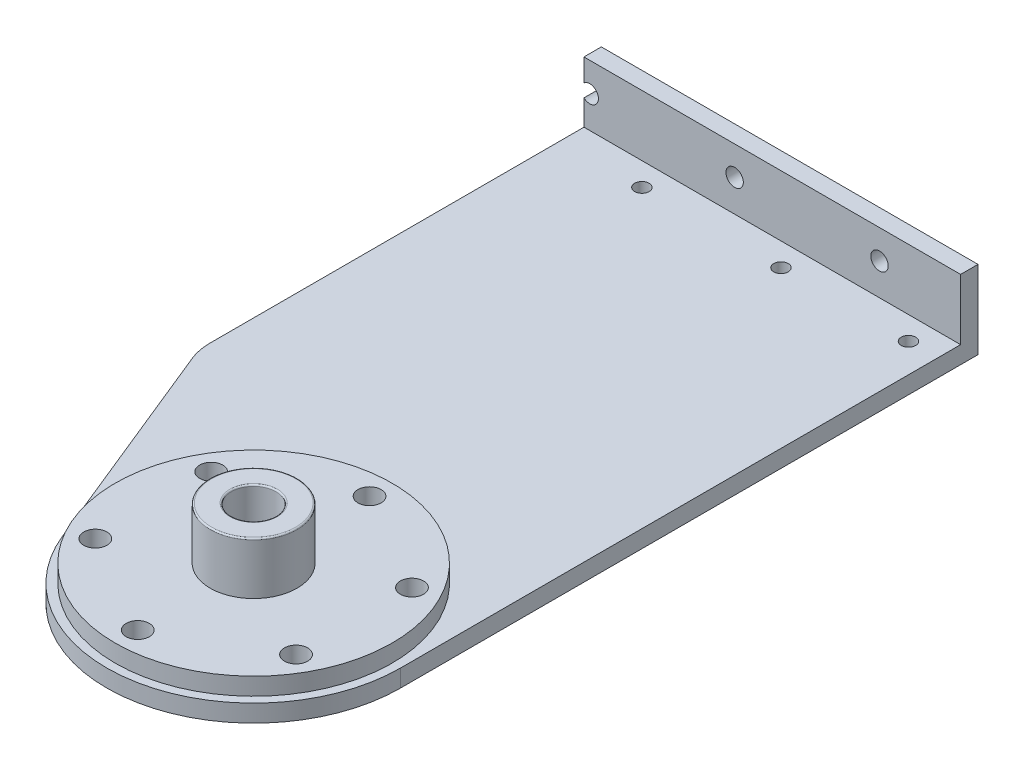
ISO-10303-21;
HEADER;
FILE_DESCRIPTION(('STEP AP214'),'2;1');
FILE_NAME('part.step','',(''),(''),'','','');
FILE_SCHEMA(('AUTOMOTIVE_DESIGN { 1 0 10303 214 1 1 1 1 }'));
ENDSEC;
DATA;
#1=APPLICATION_CONTEXT('core data for automotive mechanical design processes');
#2=APPLICATION_PROTOCOL_DEFINITION('international standard','automotive_design',2000,#1);
#3=PRODUCT_CONTEXT('',#1,'mechanical');
#4=PRODUCT('Part','Part','',(#3));
#5=PRODUCT_RELATED_PRODUCT_CATEGORY('part','',(#4));
#6=PRODUCT_DEFINITION_FORMATION('','',#4);
#7=PRODUCT_DEFINITION_CONTEXT('part definition',#1,'design');
#8=PRODUCT_DEFINITION('design','',#6,#7);
#9=PRODUCT_DEFINITION_SHAPE('','',#8);
#10=(LENGTH_UNIT() NAMED_UNIT(*) SI_UNIT(.MILLI.,.METRE.));
#11=(NAMED_UNIT(*) PLANE_ANGLE_UNIT() SI_UNIT($,.RADIAN.));
#12=(NAMED_UNIT(*) SI_UNIT($,.STERADIAN.) SOLID_ANGLE_UNIT());
#13=UNCERTAINTY_MEASURE_WITH_UNIT(LENGTH_MEASURE(1.E-05),#10,'distance_accuracy_value','');
#14=(GEOMETRIC_REPRESENTATION_CONTEXT(3) GLOBAL_UNCERTAINTY_ASSIGNED_CONTEXT((#13)) GLOBAL_UNIT_ASSIGNED_CONTEXT((#10,
#11,#12)) REPRESENTATION_CONTEXT('',''));
#15=CARTESIAN_POINT('',(0.,0.,0.));
#16=DIRECTION('',(0.,0.,1.));
#17=DIRECTION('',(1.,0.,0.));
#18=AXIS2_PLACEMENT_3D('',#15,#16,#17);
#19=CARTESIAN_POINT('',(-39.65,-3.,0.));
#20=DIRECTION('',(-1.,0.,0.));
#21=DIRECTION('',(0.,0.,1.));
#22=AXIS2_PLACEMENT_3D('',#19,#20,#21);
#23=PLANE('',#22);
#24=DIRECTION('',(0.,0.,-1.));
#25=VECTOR('',#24,1.);
#26=CARTESIAN_POINT('',(-39.65,6.6180339887499,-92.4073593128807));
#27=LINE('',#26,#25);
#28=CARTESIAN_POINT('',(-39.65,6.6180339887499,-96.65));
#29=VERTEX_POINT('',#28);
#30=CARTESIAN_POINT('',(-39.65,6.6180339887499,-99.65));
#31=VERTEX_POINT('',#30);
#32=EDGE_CURVE('E196',#29,#31,#27,.T.);
#33=ORIENTED_EDGE('',*,*,#32,.F.);
#34=DIRECTION('',(0.,1.,0.));
#35=VECTOR('',#34,1.);
#36=CARTESIAN_POINT('',(-39.65,10.5,-96.65));
#37=LINE('',#36,#35);
#38=CARTESIAN_POINT('',(-39.65,10.5,-96.65));
#39=VERTEX_POINT('',#38);
#40=EDGE_CURVE('E204',#29,#39,#37,.T.);
#41=ORIENTED_EDGE('',*,*,#40,.T.);
#42=DIRECTION('',(0.,0.,1.));
#43=VECTOR('',#42,1.);
#44=CARTESIAN_POINT('',(-39.65,10.5,-99.65));
#45=LINE('',#44,#43);
#46=CARTESIAN_POINT('',(-39.65,10.5,-99.65));
#47=VERTEX_POINT('',#46);
#48=EDGE_CURVE('E219',#47,#39,#45,.T.);
#49=ORIENTED_EDGE('',*,*,#48,.F.);
#50=DIRECTION('',(0.,1.,0.));
#51=VECTOR('',#50,1.);
#52=CARTESIAN_POINT('',(-39.65,10.5,-99.65));
#53=LINE('',#52,#51);
#54=EDGE_CURVE('E209',#31,#47,#53,.T.);
#55=ORIENTED_EDGE('',*,*,#54,.F.);
#56=EDGE_LOOP('',(#33,#41,#49,#55));
#57=FACE_BOUND('',#56,.T.);
#58=ADVANCED_FACE('F111',(#57),#23,.T.);
#59=CARTESIAN_POINT('',(0.,0.,0.));
#60=DIRECTION('',(0.,1.,0.));
#61=DIRECTION('',(0.,0.,1.));
#62=AXIS2_PLACEMENT_3D('',#59,#60,#61);
#63=PLANE('',#62);
#64=DIRECTION('',(0.,0.,1.));
#65=VECTOR('',#64,1.);
#66=CARTESIAN_POINT('',(-39.65,0.,0.));
#67=LINE('',#66,#65);
#68=CARTESIAN_POINT('',(-39.65,0.,-96.65));
#69=VERTEX_POINT('',#68);
#70=CARTESIAN_POINT('',(-39.65,0.,-32.1081531572583));
#71=VERTEX_POINT('',#70);
#72=EDGE_CURVE('E363',#69,#71,#67,.T.);
#73=ORIENTED_EDGE('',*,*,#72,.T.);
#74=CARTESIAN_POINT('',(-29.65,0.,-32.1081531572583));
#75=DIRECTION('',(0.,1.,0.));
#76=DIRECTION('',(0.,0.,1.));
#77=AXIS2_PLACEMENT_3D('',#74,#75,#76);
#78=CIRCLE('',#77,10.);
#79=CARTESIAN_POINT('',(-38.9114460863581,0.,-28.336467010522));
#80=VERTEX_POINT('',#79);
#81=EDGE_CURVE('E366',#71,#80,#78,.T.);
#82=ORIENTED_EDGE('',*,*,#81,.T.);
#83=DIRECTION('',(0.377168614673627,0.,0.92614460863581));
#84=VECTOR('',#83,1.);
#85=CARTESIAN_POINT('',(-23.4777658289178,0.,9.56122438197645));
#86=LINE('',#85,#84);
#87=CARTESIAN_POINT('',(-23.4777658289178,0.,9.56122438197645));
#88=VERTEX_POINT('',#87);
#89=EDGE_CURVE('E370',#80,#88,#86,.T.);
#90=ORIENTED_EDGE('',*,*,#89,.T.);
#91=CARTESIAN_POINT('',(0.,0.,0.));
#92=DIRECTION('',(0.,1.,0.));
#93=DIRECTION('',(0.,0.,1.));
#94=AXIS2_PLACEMENT_3D('',#91,#92,#93);
#95=CIRCLE('',#94,25.35);
#96=CARTESIAN_POINT('',(25.35,0.,0.));
#97=VERTEX_POINT('',#96);
#98=EDGE_CURVE('E374',#88,#97,#95,.T.);
#99=ORIENTED_EDGE('',*,*,#98,.T.);
#100=DIRECTION('',(0.,0.,-1.));
#101=VECTOR('',#100,1.);
#102=CARTESIAN_POINT('',(25.35,0.,0.));
#103=LINE('',#102,#101);
#104=CARTESIAN_POINT('',(25.35,0.,-96.65));
#105=VERTEX_POINT('',#104);
#106=EDGE_CURVE('E378',#97,#105,#103,.T.);
#107=ORIENTED_EDGE('',*,*,#106,.T.);
#108=DIRECTION('',(1.,0.,0.));
#109=VECTOR('',#108,1.);
#110=CARTESIAN_POINT('',(0.,0.,-96.65));
#111=LINE('',#110,#109);
#112=EDGE_CURVE('E160',#69,#105,#111,.T.);
#113=ORIENTED_EDGE('',*,*,#112,.F.);
#114=EDGE_LOOP('',(#73,#82,#90,#99,#107,#113));
#115=FACE_BOUND('',#114,.T.);
#116=CARTESIAN_POINT('',(20.35,0.,-92.65));
#117=DIRECTION('',(0.,1.,0.));
#118=DIRECTION('',(0.,0.,1.));
#119=AXIS2_PLACEMENT_3D('',#116,#117,#118);
#120=CIRCLE('',#119,1.25);
#121=CARTESIAN_POINT('',(20.35,0.,-91.4));
#122=VERTEX_POINT('',#121);
#123=EDGE_CURVE('E359',#122,#122,#120,.T.);
#124=ORIENTED_EDGE('',*,*,#123,.F.);
#125=EDGE_LOOP('',(#124));
#126=FACE_BOUND('',#125,.T.);
#127=CARTESIAN_POINT('',(-1.64999999999999,0.,-92.65));
#128=DIRECTION('',(0.,1.,0.));
#129=DIRECTION('',(0.,0.,1.));
#130=AXIS2_PLACEMENT_3D('',#127,#128,#129);
#131=CIRCLE('',#130,1.25);
#132=CARTESIAN_POINT('',(-1.64999999999999,0.,-91.4));
#133=VERTEX_POINT('',#132);
#134=EDGE_CURVE('E355',#133,#133,#131,.T.);
#135=ORIENTED_EDGE('',*,*,#134,.F.);
#136=EDGE_LOOP('',(#135));
#137=FACE_BOUND('',#136,.T.);
#138=CARTESIAN_POINT('',(-25.65,0.,-92.65));
#139=DIRECTION('',(0.,1.,0.));
#140=DIRECTION('',(0.,0.,1.));
#141=AXIS2_PLACEMENT_3D('',#138,#139,#140);
#142=CIRCLE('',#141,1.25);
#143=CARTESIAN_POINT('',(-25.65,0.,-91.4));
#144=VERTEX_POINT('',#143);
#145=EDGE_CURVE('E293',#144,#144,#142,.T.);
#146=ORIENTED_EDGE('',*,*,#145,.F.);
#147=EDGE_LOOP('',(#146));
#148=FACE_BOUND('',#147,.T.);
#149=CARTESIAN_POINT('',(0.,0.,0.));
#150=DIRECTION('',(0.,1.,0.));
#151=DIRECTION('',(0.,0.,1.));
#152=AXIS2_PLACEMENT_3D('',#149,#150,#151);
#153=CIRCLE('',#152,23.9);
#154=CARTESIAN_POINT('',(0.,0.,23.9));
#155=VERTEX_POINT('',#154);
#156=EDGE_CURVE('E281',#155,#155,#153,.T.);
#157=ORIENTED_EDGE('',*,*,#156,.F.);
#158=EDGE_LOOP('',(#157));
#159=FACE_BOUND('',#158,.T.);
#160=ADVANCED_FACE('F433',(#115,#126,#137,#148,#159),#63,.T.);
#161=DIRECTION('',(0.,0.,-1.));
#162=VECTOR('',#161,1.);
#163=CARTESIAN_POINT('',(-39.65,4.38196601125009,-92.4073593128807));
#164=LINE('',#163,#162);
#165=CARTESIAN_POINT('',(-39.65,4.3819660112501,-99.65));
#166=VERTEX_POINT('',#165);
#167=CARTESIAN_POINT('',(-39.65,4.3819660112501,-96.65));
#168=VERTEX_POINT('',#167);
#169=EDGE_CURVE('E126',#166,#168,#164,.F.);
#170=ORIENTED_EDGE('',*,*,#169,.F.);
#171=CARTESIAN_POINT('',(-39.65,-3.,-99.65));
#172=VERTEX_POINT('',#171);
#173=EDGE_CURVE('E213',#172,#166,#53,.T.);
#174=ORIENTED_EDGE('',*,*,#173,.F.);
#175=DIRECTION('',(0.,0.,1.));
#176=VECTOR('',#175,1.);
#177=CARTESIAN_POINT('',(-39.65,-3.,0.));
#178=LINE('',#177,#176);
#179=CARTESIAN_POINT('',(-39.65,-3.,-32.1081531572583));
#180=VERTEX_POINT('',#179);
#181=EDGE_CURVE('E334',#172,#180,#178,.T.);
#182=ORIENTED_EDGE('',*,*,#181,.T.);
#183=DIRECTION('',(0.,1.,0.));
#184=VECTOR('',#183,1.);
#185=CARTESIAN_POINT('',(-39.65,-3.,-32.1081531572583));
#186=LINE('',#185,#184);
#187=EDGE_CURVE('E167',#180,#71,#186,.T.);
#188=ORIENTED_EDGE('',*,*,#187,.T.);
#189=ORIENTED_EDGE('',*,*,#72,.F.);
#190=EDGE_CURVE('E241',#69,#168,#37,.T.);
#191=ORIENTED_EDGE('',*,*,#190,.T.);
#192=EDGE_LOOP('',(#170,#174,#182,#188,#189,#191));
#193=FACE_BOUND('',#192,.T.);
#194=ADVANCED_FACE('F435',(#193),#23,.T.);
#195=CARTESIAN_POINT('',(25.35,-3.,0.));
#196=DIRECTION('',(1.,0.,0.));
#197=DIRECTION('',(0.,0.,-1.));
#198=AXIS2_PLACEMENT_3D('',#195,#196,#197);
#199=PLANE('',#198);
#200=ORIENTED_EDGE('',*,*,#106,.F.);
#201=DIRECTION('',(0.,1.,0.));
#202=VECTOR('',#201,1.);
#203=CARTESIAN_POINT('',(25.35,-3.,0.));
#204=LINE('',#203,#202);
#205=CARTESIAN_POINT('',(25.35,-3.,0.));
#206=VERTEX_POINT('',#205);
#207=EDGE_CURVE('E135',#206,#97,#204,.T.);
#208=ORIENTED_EDGE('',*,*,#207,.F.);
#209=DIRECTION('',(0.,0.,-1.));
#210=VECTOR('',#209,1.);
#211=CARTESIAN_POINT('',(25.35,-3.,0.));
#212=LINE('',#211,#210);
#213=CARTESIAN_POINT('',(25.35,-3.,-99.65));
#214=VERTEX_POINT('',#213);
#215=EDGE_CURVE('E349',#206,#214,#212,.T.);
#216=ORIENTED_EDGE('',*,*,#215,.T.);
#217=DIRECTION('',(0.,-1.,0.));
#218=VECTOR('',#217,1.);
#219=CARTESIAN_POINT('',(25.35,-3.,-99.65));
#220=LINE('',#219,#218);
#221=CARTESIAN_POINT('',(25.35,10.5,-99.65));
#222=VERTEX_POINT('',#221);
#223=EDGE_CURVE('E233',#222,#214,#220,.T.);
#224=ORIENTED_EDGE('',*,*,#223,.F.);
#225=DIRECTION('',(0.,0.,1.));
#226=VECTOR('',#225,1.);
#227=CARTESIAN_POINT('',(25.35,10.5,-99.65));
#228=LINE('',#227,#226);
#229=CARTESIAN_POINT('',(25.35,10.5,-96.65));
#230=VERTEX_POINT('',#229);
#231=EDGE_CURVE('E240',#222,#230,#228,.T.);
#232=ORIENTED_EDGE('',*,*,#231,.T.);
#233=DIRECTION('',(0.,-1.,0.));
#234=VECTOR('',#233,1.);
#235=CARTESIAN_POINT('',(25.35,-3.,-96.65));
#236=LINE('',#235,#234);
#237=EDGE_CURVE('E221',#230,#105,#236,.T.);
#238=ORIENTED_EDGE('',*,*,#237,.T.);
#239=EDGE_LOOP('',(#200,#208,#216,#224,#232,#238));
#240=FACE_BOUND('',#239,.T.);
#241=ADVANCED_FACE('F443',(#240),#199,.T.);
#242=CARTESIAN_POINT('',(0.,-3.,0.));
#243=DIRECTION('',(0.,1.,0.));
#244=DIRECTION('',(0.,0.,1.));
#245=AXIS2_PLACEMENT_3D('',#242,#243,#244);
#246=CYLINDRICAL_SURFACE('',#245,25.35);
#247=ORIENTED_EDGE('',*,*,#98,.F.);
#248=DIRECTION('',(0.,1.,0.));
#249=VECTOR('',#248,1.);
#250=CARTESIAN_POINT('',(-23.4777658289178,-3.,9.56122438197645));
#251=LINE('',#250,#249);
#252=CARTESIAN_POINT('',(-23.4777658289178,-3.,9.56122438197645));
#253=VERTEX_POINT('',#252);
#254=EDGE_CURVE('E386',#253,#88,#251,.T.);
#255=ORIENTED_EDGE('',*,*,#254,.F.);
#256=CARTESIAN_POINT('',(0.,-3.,0.));
#257=DIRECTION('',(0.,1.,0.));
#258=DIRECTION('',(0.,0.,1.));
#259=AXIS2_PLACEMENT_3D('',#256,#257,#258);
#260=CIRCLE('',#259,25.35);
#261=EDGE_CURVE('E345',#253,#206,#260,.T.);
#262=ORIENTED_EDGE('',*,*,#261,.T.);
#263=ORIENTED_EDGE('',*,*,#207,.T.);
#264=EDGE_LOOP('',(#247,#255,#262,#263));
#265=FACE_BOUND('',#264,.T.);
#266=ADVANCED_FACE('F448',(#265),#246,.T.);
#267=CARTESIAN_POINT('',(-23.4777658289178,-3.,9.56122438197645));
#268=DIRECTION('',(-0.92614460863581,0.,0.377168614673627));
#269=DIRECTION('',(0.377168614673627,0.,0.92614460863581));
#270=AXIS2_PLACEMENT_3D('',#267,#268,#269);
#271=PLANE('',#270);
#272=ORIENTED_EDGE('',*,*,#89,.F.);
#273=DIRECTION('',(0.,1.,0.));
#274=VECTOR('',#273,1.);
#275=CARTESIAN_POINT('',(-38.9114460863581,-3.,-28.336467010522));
#276=LINE('',#275,#274);
#277=CARTESIAN_POINT('',(-38.9114460863581,-3.,-28.336467010522));
#278=VERTEX_POINT('',#277);
#279=EDGE_CURVE('E389',#278,#80,#276,.T.);
#280=ORIENTED_EDGE('',*,*,#279,.F.);
#281=DIRECTION('',(0.377168614673627,0.,0.92614460863581));
#282=VECTOR('',#281,1.);
#283=CARTESIAN_POINT('',(-23.4777658289178,-3.,9.56122438197645));
#284=LINE('',#283,#282);
#285=EDGE_CURVE('E341',#278,#253,#284,.T.);
#286=ORIENTED_EDGE('',*,*,#285,.T.);
#287=ORIENTED_EDGE('',*,*,#254,.T.);
#288=EDGE_LOOP('',(#272,#280,#286,#287));
#289=FACE_BOUND('',#288,.T.);
#290=ADVANCED_FACE('F532',(#289),#271,.T.);
#291=CARTESIAN_POINT('',(20.35,-3.,-92.65));
#292=DIRECTION('',(0.,1.,0.));
#293=DIRECTION('',(0.,0.,1.));
#294=AXIS2_PLACEMENT_3D('',#291,#292,#293);
#295=CYLINDRICAL_SURFACE('',#294,1.25);
#296=CARTESIAN_POINT('',(20.35,-3.,-92.65));
#297=DIRECTION('',(0.,1.,0.));
#298=DIRECTION('',(0.,0.,1.));
#299=AXIS2_PLACEMENT_3D('',#296,#297,#298);
#300=CIRCLE('',#299,1.25);
#301=CARTESIAN_POINT('',(20.35,-3.,-91.4));
#302=VERTEX_POINT('',#301);
#303=EDGE_CURVE('E330',#302,#302,#300,.T.);
#304=ORIENTED_EDGE('',*,*,#303,.F.);
#305=EDGE_LOOP('',(#304));
#306=FACE_BOUND('',#305,.T.);
#307=ORIENTED_EDGE('',*,*,#123,.T.);
#308=EDGE_LOOP('',(#307));
#309=FACE_BOUND('',#308,.T.);
#310=ADVANCED_FACE('F535',(#306,#309),#295,.F.);
#311=CARTESIAN_POINT('',(-1.64999999999999,-3.,-92.65));
#312=DIRECTION('',(0.,1.,0.));
#313=DIRECTION('',(0.,0.,1.));
#314=AXIS2_PLACEMENT_3D('',#311,#312,#313);
#315=CYLINDRICAL_SURFACE('',#314,1.25);
#316=CARTESIAN_POINT('',(-1.64999999999999,-3.,-92.65));
#317=DIRECTION('',(0.,1.,0.));
#318=DIRECTION('',(0.,0.,1.));
#319=AXIS2_PLACEMENT_3D('',#316,#317,#318);
#320=CIRCLE('',#319,1.25);
#321=CARTESIAN_POINT('',(-1.64999999999999,-3.,-91.4));
#322=VERTEX_POINT('',#321);
#323=EDGE_CURVE('E326',#322,#322,#320,.T.);
#324=ORIENTED_EDGE('',*,*,#323,.F.);
#325=EDGE_LOOP('',(#324));
#326=FACE_BOUND('',#325,.T.);
#327=ORIENTED_EDGE('',*,*,#134,.T.);
#328=EDGE_LOOP('',(#327));
#329=FACE_BOUND('',#328,.T.);
#330=ADVANCED_FACE('F577',(#326,#329),#315,.F.);
#331=CARTESIAN_POINT('',(-25.65,-3.,-92.65));
#332=DIRECTION('',(0.,1.,0.));
#333=DIRECTION('',(0.,0.,1.));
#334=AXIS2_PLACEMENT_3D('',#331,#332,#333);
#335=CYLINDRICAL_SURFACE('',#334,1.25);
#336=CARTESIAN_POINT('',(-25.65,-3.,-92.65));
#337=DIRECTION('',(0.,1.,0.));
#338=DIRECTION('',(0.,0.,1.));
#339=AXIS2_PLACEMENT_3D('',#336,#337,#338);
#340=CIRCLE('',#339,1.25);
#341=CARTESIAN_POINT('',(-25.65,-3.,-91.4));
#342=VERTEX_POINT('',#341);
#343=EDGE_CURVE('E322',#342,#342,#340,.T.);
#344=ORIENTED_EDGE('',*,*,#343,.F.);
#345=EDGE_LOOP('',(#344));
#346=FACE_BOUND('',#345,.T.);
#347=ORIENTED_EDGE('',*,*,#145,.T.);
#348=EDGE_LOOP('',(#347));
#349=FACE_BOUND('',#348,.T.);
#350=ADVANCED_FACE('F573',(#346,#349),#335,.F.);
#351=CARTESIAN_POINT('',(0.,-3.,0.));
#352=DIRECTION('',(0.,1.,0.));
#353=DIRECTION('',(0.,0.,1.));
#354=AXIS2_PLACEMENT_3D('',#351,#352,#353);
#355=CYLINDRICAL_SURFACE('',#354,7.5);
#356=CARTESIAN_POINT('',(0.,-3.,0.));
#357=DIRECTION('',(0.,1.,0.));
#358=DIRECTION('',(0.,0.,1.));
#359=AXIS2_PLACEMENT_3D('',#356,#357,#358);
#360=CIRCLE('',#359,7.5);
#361=CARTESIAN_POINT('',(0.,-3.,7.5));
#362=VERTEX_POINT('',#361);
#363=EDGE_CURVE('E318',#362,#362,#360,.T.);
#364=ORIENTED_EDGE('',*,*,#363,.F.);
#365=EDGE_LOOP('',(#364));
#366=FACE_BOUND('',#365,.T.);
#367=CARTESIAN_POINT('',(0.,0.,0.));
#368=DIRECTION('',(0.,1.,0.));
#369=DIRECTION('',(0.,0.,1.));
#370=AXIS2_PLACEMENT_3D('',#367,#368,#369);
#371=CIRCLE('',#370,7.5);
#372=CARTESIAN_POINT('',(0.,0.,7.5));
#373=VERTEX_POINT('',#372);
#374=EDGE_CURVE('E286',#373,#373,#371,.F.);
#375=ORIENTED_EDGE('',*,*,#374,.F.);
#376=EDGE_LOOP('',(#375));
#377=FACE_BOUND('',#376,.T.);
#378=ADVANCED_FACE('F569',(#366,#377),#355,.F.);
#379=CARTESIAN_POINT('',(0.,-3.,-20.));
#380=DIRECTION('',(0.,1.,0.));
#381=DIRECTION('',(0.,0.,1.));
#382=AXIS2_PLACEMENT_3D('',#379,#380,#381);
#383=CYLINDRICAL_SURFACE('',#382,2.);
#384=CARTESIAN_POINT('',(0.,-3.,-20.));
#385=DIRECTION('',(0.,1.,0.));
#386=DIRECTION('',(0.,0.,1.));
#387=AXIS2_PLACEMENT_3D('',#384,#385,#386);
#388=CIRCLE('',#387,2.);
#389=CARTESIAN_POINT('',(0.,-3.,-18.));
#390=VERTEX_POINT('',#389);
#391=EDGE_CURVE('E314',#390,#390,#388,.T.);
#392=ORIENTED_EDGE('',*,*,#391,.F.);
#393=EDGE_LOOP('',(#392));
#394=FACE_BOUND('',#393,.T.);
#395=CARTESIAN_POINT('',(0.,3.,-20.));
#396=DIRECTION('',(0.,1.,0.));
#397=DIRECTION('',(0.,0.,1.));
#398=AXIS2_PLACEMENT_3D('',#395,#396,#397);
#399=CIRCLE('',#398,2.);
#400=CARTESIAN_POINT('',(0.,3.,-18.));
#401=VERTEX_POINT('',#400);
#402=EDGE_CURVE('E277',#401,#401,#399,.T.);
#403=ORIENTED_EDGE('',*,*,#402,.T.);
#404=EDGE_LOOP('',(#403));
#405=FACE_BOUND('',#404,.T.);
#406=ADVANCED_FACE('F565',(#394,#405),#383,.F.);
#407=CARTESIAN_POINT('',(17.3205080756894,-3.,-10.000000000001));
#408=DIRECTION('',(0.,1.,0.));
#409=DIRECTION('',(0.,0.,1.));
#410=AXIS2_PLACEMENT_3D('',#407,#408,#409);
#411=CYLINDRICAL_SURFACE('',#410,2.);
#412=CARTESIAN_POINT('',(17.3205080756894,-3.,-10.000000000001));
#413=DIRECTION('',(0.,1.,0.));
#414=DIRECTION('',(0.,0.,1.));
#415=AXIS2_PLACEMENT_3D('',#412,#413,#414);
#416=CIRCLE('',#415,2.);
#417=CARTESIAN_POINT('',(17.3205080756894,-3.,-8.00000000000101));
#418=VERTEX_POINT('',#417);
#419=EDGE_CURVE('E310',#418,#418,#416,.T.);
#420=ORIENTED_EDGE('',*,*,#419,.F.);
#421=EDGE_LOOP('',(#420));
#422=FACE_BOUND('',#421,.T.);
#423=CARTESIAN_POINT('',(17.3205080756894,3.,-10.000000000001));
#424=DIRECTION('',(0.,1.,0.));
#425=DIRECTION('',(0.,0.,1.));
#426=AXIS2_PLACEMENT_3D('',#423,#424,#425);
#427=CIRCLE('',#426,2.);
#428=CARTESIAN_POINT('',(17.3205080756894,3.,-8.00000000000101));
#429=VERTEX_POINT('',#428);
#430=EDGE_CURVE('E273',#429,#429,#427,.T.);
#431=ORIENTED_EDGE('',*,*,#430,.T.);
#432=EDGE_LOOP('',(#431));
#433=FACE_BOUND('',#432,.T.);
#434=ADVANCED_FACE('F561',(#422,#433),#411,.F.);
#435=CARTESIAN_POINT('',(17.3205080756905,-3.,9.99999999999899));
#436=DIRECTION('',(0.,1.,0.));
#437=DIRECTION('',(0.,0.,1.));
#438=AXIS2_PLACEMENT_3D('',#435,#436,#437);
#439=CYLINDRICAL_SURFACE('',#438,2.);
#440=CARTESIAN_POINT('',(17.3205080756905,-3.,9.99999999999899));
#441=DIRECTION('',(0.,1.,0.));
#442=DIRECTION('',(0.,0.,1.));
#443=AXIS2_PLACEMENT_3D('',#440,#441,#442);
#444=CIRCLE('',#443,2.);
#445=CARTESIAN_POINT('',(17.3205080756905,-3.,11.999999999999));
#446=VERTEX_POINT('',#445);
#447=EDGE_CURVE('E306',#446,#446,#444,.T.);
#448=ORIENTED_EDGE('',*,*,#447,.F.);
#449=EDGE_LOOP('',(#448));
#450=FACE_BOUND('',#449,.T.);
#451=CARTESIAN_POINT('',(17.3205080756905,3.,9.99999999999899));
#452=DIRECTION('',(0.,1.,0.));
#453=DIRECTION('',(0.,0.,1.));
#454=AXIS2_PLACEMENT_3D('',#451,#452,#453);
#455=CIRCLE('',#454,2.);
#456=CARTESIAN_POINT('',(17.3205080756905,3.,11.999999999999));
#457=VERTEX_POINT('',#456);
#458=EDGE_CURVE('E269',#457,#457,#455,.T.);
#459=ORIENTED_EDGE('',*,*,#458,.T.);
#460=EDGE_LOOP('',(#459));
#461=FACE_BOUND('',#460,.T.);
#462=ADVANCED_FACE('F557',(#450,#461),#439,.F.);
#463=CARTESIAN_POINT('',(2.32298736313842E-12,-3.,20.));
#464=DIRECTION('',(0.,1.,0.));
#465=DIRECTION('',(0.,0.,1.));
#466=AXIS2_PLACEMENT_3D('',#463,#464,#465);
#467=CYLINDRICAL_SURFACE('',#466,2.);
#468=CARTESIAN_POINT('',(2.32298736313842E-12,-3.,20.));
#469=DIRECTION('',(0.,1.,0.));
#470=DIRECTION('',(0.,0.,1.));
#471=AXIS2_PLACEMENT_3D('',#468,#469,#470);
#472=CIRCLE('',#471,2.);
#473=CARTESIAN_POINT('',(2.32298736313842E-12,-3.,22.));
#474=VERTEX_POINT('',#473);
#475=EDGE_CURVE('E302',#474,#474,#472,.T.);
#476=ORIENTED_EDGE('',*,*,#475,.F.);
#477=EDGE_LOOP('',(#476));
#478=FACE_BOUND('',#477,.T.);
#479=CARTESIAN_POINT('',(2.32298736313842E-12,3.,20.));
#480=DIRECTION('',(0.,1.,0.));
#481=DIRECTION('',(0.,0.,1.));
#482=AXIS2_PLACEMENT_3D('',#479,#480,#481);
#483=CIRCLE('',#482,2.);
#484=CARTESIAN_POINT('',(2.32298736313842E-12,3.,22.));
#485=VERTEX_POINT('',#484);
#486=EDGE_CURVE('E265',#485,#485,#483,.T.);
#487=ORIENTED_EDGE('',*,*,#486,.T.);
#488=EDGE_LOOP('',(#487));
#489=FACE_BOUND('',#488,.T.);
#490=ADVANCED_FACE('F549',(#478,#489),#467,.F.);
#491=CARTESIAN_POINT('',(-17.320508075687,-3.,10.000000000001));
#492=DIRECTION('',(0.,1.,0.));
#493=DIRECTION('',(0.,0.,1.));
#494=AXIS2_PLACEMENT_3D('',#491,#492,#493);
#495=CYLINDRICAL_SURFACE('',#494,2.);
#496=CARTESIAN_POINT('',(-17.320508075687,-3.,10.000000000001));
#497=DIRECTION('',(0.,1.,0.));
#498=DIRECTION('',(0.,0.,1.));
#499=AXIS2_PLACEMENT_3D('',#496,#497,#498);
#500=CIRCLE('',#499,2.);
#501=CARTESIAN_POINT('',(-17.320508075687,-3.,12.000000000001));
#502=VERTEX_POINT('',#501);
#503=EDGE_CURVE('E298',#502,#502,#500,.T.);
#504=ORIENTED_EDGE('',*,*,#503,.F.);
#505=EDGE_LOOP('',(#504));
#506=FACE_BOUND('',#505,.T.);
#507=CARTESIAN_POINT('',(-17.320508075687,3.,10.000000000001));
#508=DIRECTION('',(0.,1.,0.));
#509=DIRECTION('',(0.,0.,1.));
#510=AXIS2_PLACEMENT_3D('',#507,#508,#509);
#511=CIRCLE('',#510,2.);
#512=CARTESIAN_POINT('',(-17.320508075687,3.,12.000000000001));
#513=VERTEX_POINT('',#512);
#514=EDGE_CURVE('E261',#513,#513,#511,.T.);
#515=ORIENTED_EDGE('',*,*,#514,.T.);
#516=EDGE_LOOP('',(#515));
#517=FACE_BOUND('',#516,.T.);
#518=ADVANCED_FACE('F543',(#506,#517),#495,.F.);
#519=CARTESIAN_POINT('',(-17.3205080756882,-3.,-9.99999999999898));
#520=DIRECTION('',(0.,1.,0.));
#521=DIRECTION('',(0.,0.,1.));
#522=AXIS2_PLACEMENT_3D('',#519,#520,#521);
#523=CYLINDRICAL_SURFACE('',#522,2.);
#524=CARTESIAN_POINT('',(-17.3205080756882,-3.,-9.99999999999898));
#525=DIRECTION('',(0.,1.,0.));
#526=DIRECTION('',(0.,0.,1.));
#527=AXIS2_PLACEMENT_3D('',#524,#525,#526);
#528=CIRCLE('',#527,2.);
#529=CARTESIAN_POINT('',(-17.3205080756882,-3.,-7.99999999999898));
#530=VERTEX_POINT('',#529);
#531=EDGE_CURVE('E294',#530,#530,#528,.T.);
#532=ORIENTED_EDGE('',*,*,#531,.F.);
#533=EDGE_LOOP('',(#532));
#534=FACE_BOUND('',#533,.T.);
#535=CARTESIAN_POINT('',(-17.3205080756882,3.,-9.99999999999898));
#536=DIRECTION('',(0.,1.,0.));
#537=DIRECTION('',(0.,0.,1.));
#538=AXIS2_PLACEMENT_3D('',#535,#536,#537);
#539=CIRCLE('',#538,2.);
#540=CARTESIAN_POINT('',(-17.3205080756882,3.,-7.99999999999898));
#541=VERTEX_POINT('',#540);
#542=EDGE_CURVE('E257',#541,#541,#539,.T.);
#543=ORIENTED_EDGE('',*,*,#542,.T.);
#544=EDGE_LOOP('',(#543));
#545=FACE_BOUND('',#544,.T.);
#546=ADVANCED_FACE('F538',(#534,#545),#523,.F.);
#547=CARTESIAN_POINT('',(-29.65,-3.,-32.1081531572583));
#548=DIRECTION('',(0.,1.,0.));
#549=DIRECTION('',(0.,0.,1.));
#550=AXIS2_PLACEMENT_3D('',#547,#548,#549);
#551=CYLINDRICAL_SURFACE('',#550,10.);
#552=ORIENTED_EDGE('',*,*,#81,.F.);
#553=ORIENTED_EDGE('',*,*,#187,.F.);
#554=CARTESIAN_POINT('',(-29.65,-3.,-32.1081531572583));
#555=DIRECTION('',(0.,1.,0.));
#556=DIRECTION('',(0.,0.,1.));
#557=AXIS2_PLACEMENT_3D('',#554,#555,#556);
#558=CIRCLE('',#557,10.);
#559=EDGE_CURVE('E338',#180,#278,#558,.T.);
#560=ORIENTED_EDGE('',*,*,#559,.T.);
#561=ORIENTED_EDGE('',*,*,#279,.T.);
#562=EDGE_LOOP('',(#552,#553,#560,#561));
#563=FACE_BOUND('',#562,.T.);
#564=ADVANCED_FACE('F499',(#563),#551,.T.);
#565=CARTESIAN_POINT('',(0.,-3.,0.));
#566=DIRECTION('',(0.,1.,0.));
#567=DIRECTION('',(0.,0.,1.));
#568=AXIS2_PLACEMENT_3D('',#565,#566,#567);
#569=PLANE('',#568);
#570=ORIENTED_EDGE('',*,*,#531,.T.);
#571=EDGE_LOOP('',(#570));
#572=FACE_BOUND('',#571,.T.);
#573=ORIENTED_EDGE('',*,*,#503,.T.);
#574=EDGE_LOOP('',(#573));
#575=FACE_BOUND('',#574,.T.);
#576=ORIENTED_EDGE('',*,*,#475,.T.);
#577=EDGE_LOOP('',(#576));
#578=FACE_BOUND('',#577,.T.);
#579=ORIENTED_EDGE('',*,*,#447,.T.);
#580=EDGE_LOOP('',(#579));
#581=FACE_BOUND('',#580,.T.);
#582=ORIENTED_EDGE('',*,*,#419,.T.);
#583=EDGE_LOOP('',(#582));
#584=FACE_BOUND('',#583,.T.);
#585=ORIENTED_EDGE('',*,*,#391,.T.);
#586=EDGE_LOOP('',(#585));
#587=FACE_BOUND('',#586,.T.);
#588=ORIENTED_EDGE('',*,*,#363,.T.);
#589=EDGE_LOOP('',(#588));
#590=FACE_BOUND('',#589,.T.);
#591=ORIENTED_EDGE('',*,*,#343,.T.);
#592=EDGE_LOOP('',(#591));
#593=FACE_BOUND('',#592,.T.);
#594=ORIENTED_EDGE('',*,*,#323,.T.);
#595=EDGE_LOOP('',(#594));
#596=FACE_BOUND('',#595,.T.);
#597=ORIENTED_EDGE('',*,*,#303,.T.);
#598=EDGE_LOOP('',(#597));
#599=FACE_BOUND('',#598,.T.);
#600=ORIENTED_EDGE('',*,*,#181,.F.);
#601=DIRECTION('',(-1.,0.,0.));
#602=VECTOR('',#601,1.);
#603=CARTESIAN_POINT('',(-39.65,-3.,-99.65));
#604=LINE('',#603,#602);
#605=EDGE_CURVE('E237',#214,#172,#604,.T.);
#606=ORIENTED_EDGE('',*,*,#605,.F.);
#607=ORIENTED_EDGE('',*,*,#215,.F.);
#608=ORIENTED_EDGE('',*,*,#261,.F.);
#609=ORIENTED_EDGE('',*,*,#285,.F.);
#610=ORIENTED_EDGE('',*,*,#559,.F.);
#611=EDGE_LOOP('',(#600,#606,#607,#608,#609,#610));
#612=FACE_BOUND('',#611,.T.);
#613=ADVANCED_FACE('F496',(#572,#575,#578,#581,#584,#587,#590,#593,#596,#599,#612),#569,.F.);
#614=CARTESIAN_POINT('',(0.,0.,0.));
#615=DIRECTION('',(0.,1.,0.));
#616=DIRECTION('',(0.,0.,1.));
#617=AXIS2_PLACEMENT_3D('',#614,#615,#616);
#618=PLANE('',#617);
#619=CARTESIAN_POINT('',(0.,0.,0.));
#620=DIRECTION('',(0.,1.,0.));
#621=DIRECTION('',(0.,0.,1.));
#622=AXIS2_PLACEMENT_3D('',#619,#620,#621);
#623=CIRCLE('',#622,3.85);
#624=CARTESIAN_POINT('',(0.,0.,3.85));
#625=VERTEX_POINT('',#624);
#626=EDGE_CURVE('E253',#625,#625,#623,.T.);
#627=ORIENTED_EDGE('',*,*,#626,.T.);
#628=EDGE_LOOP('',(#627));
#629=FACE_BOUND('',#628,.T.);
#630=ORIENTED_EDGE('',*,*,#374,.T.);
#631=EDGE_LOOP('',(#630));
#632=FACE_BOUND('',#631,.T.);
#633=ADVANCED_FACE('F521',(#629,#632),#618,.F.);
#634=CARTESIAN_POINT('',(0.,3.,0.));
#635=DIRECTION('',(0.,1.,0.));
#636=DIRECTION('',(0.,0.,1.));
#637=AXIS2_PLACEMENT_3D('',#634,#635,#636);
#638=PLANE('',#637);
#639=CARTESIAN_POINT('',(0.,3.,0.));
#640=DIRECTION('',(0.,1.,0.));
#641=DIRECTION('',(0.,0.,1.));
#642=AXIS2_PLACEMENT_3D('',#639,#640,#641);
#643=CIRCLE('',#642,7.5);
#644=CARTESIAN_POINT('',(0.,3.,7.5));
#645=VERTEX_POINT('',#644);
#646=EDGE_CURVE('E252',#645,#645,#643,.F.);
#647=ORIENTED_EDGE('',*,*,#646,.T.);
#648=EDGE_LOOP('',(#647));
#649=FACE_BOUND('',#648,.T.);
#650=ORIENTED_EDGE('',*,*,#542,.F.);
#651=EDGE_LOOP('',(#650));
#652=FACE_BOUND('',#651,.T.);
#653=ORIENTED_EDGE('',*,*,#486,.F.);
#654=EDGE_LOOP('',(#653));
#655=FACE_BOUND('',#654,.T.);
#656=ORIENTED_EDGE('',*,*,#430,.F.);
#657=EDGE_LOOP('',(#656));
#658=FACE_BOUND('',#657,.T.);
#659=CARTESIAN_POINT('',(0.,3.,0.));
#660=DIRECTION('',(0.,1.,0.));
#661=DIRECTION('',(0.,0.,1.));
#662=AXIS2_PLACEMENT_3D('',#659,#660,#661);
#663=CIRCLE('',#662,23.9);
#664=CARTESIAN_POINT('',(0.,3.,23.9));
#665=VERTEX_POINT('',#664);
#666=EDGE_CURVE('E282',#665,#665,#663,.T.);
#667=ORIENTED_EDGE('',*,*,#666,.T.);
#668=EDGE_LOOP('',(#667));
#669=FACE_BOUND('',#668,.T.);
#670=ORIENTED_EDGE('',*,*,#402,.F.);
#671=EDGE_LOOP('',(#670));
#672=FACE_BOUND('',#671,.T.);
#673=ORIENTED_EDGE('',*,*,#458,.F.);
#674=EDGE_LOOP('',(#673));
#675=FACE_BOUND('',#674,.T.);
#676=ORIENTED_EDGE('',*,*,#514,.F.);
#677=EDGE_LOOP('',(#676));
#678=FACE_BOUND('',#677,.T.);
#679=ADVANCED_FACE('F512',(#649,#652,#655,#658,#669,#672,#675,#678),#638,.T.);
#680=CARTESIAN_POINT('',(0.,3.,0.));
#681=DIRECTION('',(0.,-1.,0.));
#682=DIRECTION('',(0.,0.,-1.));
#683=AXIS2_PLACEMENT_3D('',#680,#681,#682);
#684=CYLINDRICAL_SURFACE('',#683,23.9);
#685=ORIENTED_EDGE('',*,*,#666,.F.);
#686=EDGE_LOOP('',(#685));
#687=FACE_BOUND('',#686,.T.);
#688=ORIENTED_EDGE('',*,*,#156,.T.);
#689=EDGE_LOOP('',(#688));
#690=FACE_BOUND('',#689,.T.);
#691=ADVANCED_FACE('F510',(#687,#690),#684,.T.);
#692=CARTESIAN_POINT('',(0.,3.,0.));
#693=DIRECTION('',(0.,-1.,0.));
#694=DIRECTION('',(0.,0.,-1.));
#695=AXIS2_PLACEMENT_3D('',#692,#693,#694);
#696=CYLINDRICAL_SURFACE('',#695,3.85);
#697=CARTESIAN_POINT('',(0.,11.75,0.));
#698=DIRECTION('',(0.,1.,0.));
#699=DIRECTION('',(0.,0.,1.));
#700=AXIS2_PLACEMENT_3D('',#697,#698,#699);
#701=CIRCLE('',#700,3.85);
#702=CARTESIAN_POINT('',(0.,11.75,3.85));
#703=VERTEX_POINT('',#702);
#704=EDGE_CURVE('E385',#703,#703,#701,.T.);
#705=ORIENTED_EDGE('',*,*,#704,.T.);
#706=EDGE_LOOP('',(#705));
#707=FACE_BOUND('',#706,.T.);
#708=ORIENTED_EDGE('',*,*,#626,.F.);
#709=EDGE_LOOP('',(#708));
#710=FACE_BOUND('',#709,.T.);
#711=ADVANCED_FACE('F429',(#707,#710),#696,.F.);
#712=CARTESIAN_POINT('',(0.,12.,0.));
#713=DIRECTION('',(0.,-1.,0.));
#714=DIRECTION('',(0.,0.,-1.));
#715=AXIS2_PLACEMENT_3D('',#712,#713,#714);
#716=CYLINDRICAL_SURFACE('',#715,7.5);
#717=CARTESIAN_POINT('',(0.,11.75,0.));
#718=DIRECTION('',(0.,1.,0.));
#719=DIRECTION('',(0.,0.,1.));
#720=AXIS2_PLACEMENT_3D('',#717,#718,#719);
#721=CIRCLE('',#720,7.5);
#722=CARTESIAN_POINT('',(0.,11.75,7.5));
#723=VERTEX_POINT('',#722);
#724=EDGE_CURVE('E120',#723,#723,#721,.F.);
#725=ORIENTED_EDGE('',*,*,#724,.T.);
#726=EDGE_LOOP('',(#725));
#727=FACE_BOUND('',#726,.T.);
#728=ORIENTED_EDGE('',*,*,#646,.F.);
#729=EDGE_LOOP('',(#728));
#730=FACE_BOUND('',#729,.T.);
#731=ADVANCED_FACE('F411',(#727,#730),#716,.T.);
#732=CARTESIAN_POINT('',(0.,12.,0.));
#733=DIRECTION('',(0.,1.,0.));
#734=DIRECTION('',(0.,0.,1.));
#735=AXIS2_PLACEMENT_3D('',#732,#733,#734);
#736=PLANE('',#735);
#737=CARTESIAN_POINT('',(0.,12.,0.));
#738=DIRECTION('',(0.,1.,0.));
#739=DIRECTION('',(0.,0.,1.));
#740=AXIS2_PLACEMENT_3D('',#737,#738,#739);
#741=CIRCLE('',#740,4.1);
#742=CARTESIAN_POINT('',(0.,12.,4.1));
#743=VERTEX_POINT('',#742);
#744=EDGE_CURVE('E404',#743,#743,#741,.F.);
#745=ORIENTED_EDGE('',*,*,#744,.T.);
#746=EDGE_LOOP('',(#745));
#747=FACE_BOUND('',#746,.T.);
#748=CARTESIAN_POINT('',(0.,12.,0.));
#749=DIRECTION('',(0.,1.,0.));
#750=DIRECTION('',(0.,0.,1.));
#751=AXIS2_PLACEMENT_3D('',#748,#749,#750);
#752=CIRCLE('',#751,7.25);
#753=CARTESIAN_POINT('',(0.,12.,7.25));
#754=VERTEX_POINT('',#753);
#755=EDGE_CURVE('E400',#754,#754,#752,.T.);
#756=ORIENTED_EDGE('',*,*,#755,.T.);
#757=EDGE_LOOP('',(#756));
#758=FACE_BOUND('',#757,.T.);
#759=ADVANCED_FACE('F420',(#747,#758),#736,.T.);
#760=CARTESIAN_POINT('',(0.,11.75,0.));
#761=DIRECTION('',(0.,1.,0.));
#762=DIRECTION('',(0.,0.,1.));
#763=AXIS2_PLACEMENT_3D('',#760,#761,#762);
#764=TOROIDAL_SURFACE('',#763,4.1,0.25);
#765=ORIENTED_EDGE('',*,*,#744,.F.);
#766=EDGE_LOOP('',(#765));
#767=FACE_BOUND('',#766,.T.);
#768=ORIENTED_EDGE('',*,*,#704,.F.);
#769=EDGE_LOOP('',(#768));
#770=FACE_BOUND('',#769,.T.);
#771=ADVANCED_FACE('F417',(#767,#770),#764,.T.);
#772=CARTESIAN_POINT('',(0.,11.75,0.));
#773=DIRECTION('',(0.,1.,0.));
#774=DIRECTION('',(0.,0.,1.));
#775=AXIS2_PLACEMENT_3D('',#772,#773,#774);
#776=TOROIDAL_SURFACE('',#775,7.25,0.25);
#777=ORIENTED_EDGE('',*,*,#724,.F.);
#778=EDGE_LOOP('',(#777));
#779=FACE_BOUND('',#778,.T.);
#780=ORIENTED_EDGE('',*,*,#755,.F.);
#781=EDGE_LOOP('',(#780));
#782=FACE_BOUND('',#781,.T.);
#783=ADVANCED_FACE('F113',(#779,#782),#776,.T.);
#784=CARTESIAN_POINT('',(25.35,10.5,-99.65));
#785=DIRECTION('',(0.,-1.,0.));
#786=DIRECTION('',(0.,0.,-1.));
#787=AXIS2_PLACEMENT_3D('',#784,#785,#786);
#788=PLANE('',#787);
#789=DIRECTION('',(1.,0.,0.));
#790=VECTOR('',#789,1.);
#791=CARTESIAN_POINT('',(25.35,10.5,-96.65));
#792=LINE('',#791,#790);
#793=EDGE_CURVE('E227',#39,#230,#792,.T.);
#794=ORIENTED_EDGE('',*,*,#793,.T.);
#795=ORIENTED_EDGE('',*,*,#231,.F.);
#796=DIRECTION('',(1.,0.,0.));
#797=VECTOR('',#796,1.);
#798=CARTESIAN_POINT('',(25.35,10.5,-99.65));
#799=LINE('',#798,#797);
#800=EDGE_CURVE('E225',#47,#222,#799,.T.);
#801=ORIENTED_EDGE('',*,*,#800,.F.);
#802=ORIENTED_EDGE('',*,*,#48,.T.);
#803=EDGE_LOOP('',(#794,#795,#801,#802));
#804=FACE_BOUND('',#803,.T.);
#805=ADVANCED_FACE('F416',(#804),#788,.F.);
#806=CARTESIAN_POINT('',(0.,0.,-99.65));
#807=DIRECTION('',(0.,0.,1.));
#808=DIRECTION('',(1.,0.,0.));
#809=AXIS2_PLACEMENT_3D('',#806,#807,#808);
#810=PLANE('',#809);
#811=CARTESIAN_POINT('',(11.35,5.5,-99.65));
#812=DIRECTION('',(0.,0.,-1.));
#813=DIRECTION('',(-1.,0.,0.));
#814=AXIS2_PLACEMENT_3D('',#811,#812,#813);
#815=CIRCLE('',#814,1.5);
#816=CARTESIAN_POINT('',(9.84999999999999,5.5,-99.65));
#817=VERTEX_POINT('',#816);
#818=EDGE_CURVE('E455',#817,#817,#815,.T.);
#819=ORIENTED_EDGE('',*,*,#818,.F.);
#820=EDGE_LOOP('',(#819));
#821=FACE_BOUND('',#820,.T.);
#822=CARTESIAN_POINT('',(-13.65,5.5,-99.65));
#823=DIRECTION('',(0.,0.,-1.));
#824=DIRECTION('',(-1.,0.,0.));
#825=AXIS2_PLACEMENT_3D('',#822,#823,#824);
#826=CIRCLE('',#825,1.5);
#827=CARTESIAN_POINT('',(-15.15,5.5,-99.65));
#828=VERTEX_POINT('',#827);
#829=EDGE_CURVE('E458',#828,#828,#826,.T.);
#830=ORIENTED_EDGE('',*,*,#829,.F.);
#831=EDGE_LOOP('',(#830));
#832=FACE_BOUND('',#831,.T.);
#833=ORIENTED_EDGE('',*,*,#173,.T.);
#834=CARTESIAN_POINT('',(-38.65,5.5,-99.65));
#835=DIRECTION('',(0.,0.,-1.));
#836=DIRECTION('',(-1.,0.,0.));
#837=AXIS2_PLACEMENT_3D('',#834,#835,#836);
#838=CIRCLE('',#837,1.5);
#839=EDGE_CURVE('E199',#31,#166,#838,.T.);
#840=ORIENTED_EDGE('',*,*,#839,.F.);
#841=ORIENTED_EDGE('',*,*,#54,.T.);
#842=ORIENTED_EDGE('',*,*,#800,.T.);
#843=ORIENTED_EDGE('',*,*,#223,.T.);
#844=ORIENTED_EDGE('',*,*,#605,.T.);
#845=EDGE_LOOP('',(#833,#840,#841,#842,#843,#844));
#846=FACE_BOUND('',#845,.T.);
#847=ADVANCED_FACE('F208',(#821,#832,#846),#810,.F.);
#848=CARTESIAN_POINT('',(0.,0.,-96.65));
#849=DIRECTION('',(0.,0.,1.));
#850=DIRECTION('',(1.,0.,0.));
#851=AXIS2_PLACEMENT_3D('',#848,#849,#850);
#852=PLANE('',#851);
#853=CARTESIAN_POINT('',(11.35,5.5,-96.65));
#854=DIRECTION('',(0.,0.,1.));
#855=DIRECTION('',(1.,0.,0.));
#856=AXIS2_PLACEMENT_3D('',#853,#854,#855);
#857=CIRCLE('',#856,1.5);
#858=CARTESIAN_POINT('',(12.85,5.5,-96.65));
#859=VERTEX_POINT('',#858);
#860=EDGE_CURVE('E452',#859,#859,#857,.F.);
#861=ORIENTED_EDGE('',*,*,#860,.T.);
#862=EDGE_LOOP('',(#861));
#863=FACE_BOUND('',#862,.T.);
#864=CARTESIAN_POINT('',(-13.65,5.5,-96.65));
#865=DIRECTION('',(0.,0.,1.));
#866=DIRECTION('',(1.,0.,0.));
#867=AXIS2_PLACEMENT_3D('',#864,#865,#866);
#868=CIRCLE('',#867,1.5);
#869=CARTESIAN_POINT('',(-12.15,5.5,-96.65));
#870=VERTEX_POINT('',#869);
#871=EDGE_CURVE('E215',#870,#870,#868,.F.);
#872=ORIENTED_EDGE('',*,*,#871,.T.);
#873=EDGE_LOOP('',(#872));
#874=FACE_BOUND('',#873,.T.);
#875=CARTESIAN_POINT('',(-38.65,5.5,-96.65));
#876=DIRECTION('',(0.,0.,1.));
#877=DIRECTION('',(1.,0.,0.));
#878=AXIS2_PLACEMENT_3D('',#875,#876,#877);
#879=CIRCLE('',#878,1.5);
#880=EDGE_CURVE('E12',#168,#29,#879,.T.);
#881=ORIENTED_EDGE('',*,*,#880,.F.);
#882=ORIENTED_EDGE('',*,*,#190,.F.);
#883=ORIENTED_EDGE('',*,*,#112,.T.);
#884=ORIENTED_EDGE('',*,*,#237,.F.);
#885=ORIENTED_EDGE('',*,*,#793,.F.);
#886=ORIENTED_EDGE('',*,*,#40,.F.);
#887=EDGE_LOOP('',(#881,#882,#883,#884,#885,#886));
#888=FACE_BOUND('',#887,.T.);
#889=ADVANCED_FACE('F474',(#863,#874,#888),#852,.T.);
#890=CARTESIAN_POINT('',(-38.65,5.5,-92.4073593128807));
#891=DIRECTION('',(0.,0.,-1.));
#892=DIRECTION('',(-1.,0.,0.));
#893=AXIS2_PLACEMENT_3D('',#890,#891,#892);
#894=CYLINDRICAL_SURFACE('',#893,1.5);
#895=ORIENTED_EDGE('',*,*,#32,.T.);
#896=ORIENTED_EDGE('',*,*,#839,.T.);
#897=ORIENTED_EDGE('',*,*,#169,.T.);
#898=ORIENTED_EDGE('',*,*,#880,.T.);
#899=EDGE_LOOP('',(#895,#896,#897,#898));
#900=FACE_BOUND('',#899,.T.);
#901=ADVANCED_FACE('F198',(#900),#894,.F.);
#902=CARTESIAN_POINT('',(-13.65,5.5,-92.4073593128807));
#903=DIRECTION('',(0.,0.,-1.));
#904=DIRECTION('',(-1.,0.,0.));
#905=AXIS2_PLACEMENT_3D('',#902,#903,#904);
#906=CYLINDRICAL_SURFACE('',#905,1.5);
#907=ORIENTED_EDGE('',*,*,#829,.T.);
#908=EDGE_LOOP('',(#907));
#909=FACE_BOUND('',#908,.T.);
#910=ORIENTED_EDGE('',*,*,#871,.F.);
#911=EDGE_LOOP('',(#910));
#912=FACE_BOUND('',#911,.T.);
#913=ADVANCED_FACE('F478',(#909,#912),#906,.F.);
#914=CARTESIAN_POINT('',(11.35,5.5,-92.4073593128807));
#915=DIRECTION('',(0.,0.,-1.));
#916=DIRECTION('',(-1.,0.,0.));
#917=AXIS2_PLACEMENT_3D('',#914,#915,#916);
#918=CYLINDRICAL_SURFACE('',#917,1.5);
#919=ORIENTED_EDGE('',*,*,#818,.T.);
#920=EDGE_LOOP('',(#919));
#921=FACE_BOUND('',#920,.T.);
#922=ORIENTED_EDGE('',*,*,#860,.F.);
#923=EDGE_LOOP('',(#922));
#924=FACE_BOUND('',#923,.T.);
#925=ADVANCED_FACE('F469',(#921,#924),#918,.F.);
#926=CLOSED_SHELL('',(#58,#160,#194,#241,#266,#290,#310,#330,#350,#378,#406,#434,#462,#490,#518,
#546,#564,#613,#633,#679,#691,#711,#731,#759,#771,#783,#805,#847,#889,#901,#913,#925));
#927=MANIFOLD_SOLID_BREP('B2',#926);
#928=ADVANCED_BREP_SHAPE_REPRESENTATION('',(#18,#927),#14);
#929=SHAPE_DEFINITION_REPRESENTATION(#9,#928);
ENDSEC;
END-ISO-10303-21;
